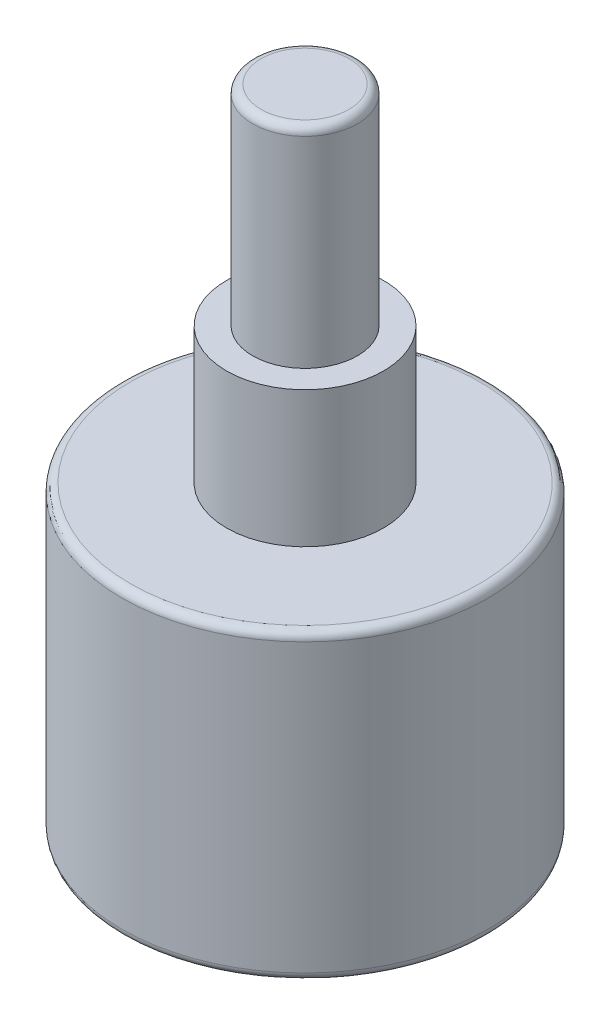
ISO-10303-21;
HEADER;
FILE_DESCRIPTION(('STEP AP214'),'2;1');
FILE_NAME('part.step','',(''),(''),'','','');
FILE_SCHEMA(('AUTOMOTIVE_DESIGN { 1 0 10303 214 1 1 1 1 }'));
ENDSEC;
DATA;
#1=APPLICATION_CONTEXT('core data for automotive mechanical design processes');
#2=APPLICATION_PROTOCOL_DEFINITION('international standard','automotive_design',2000,#1);
#3=PRODUCT_CONTEXT('',#1,'mechanical');
#4=PRODUCT('Part','Part','',(#3));
#5=PRODUCT_RELATED_PRODUCT_CATEGORY('part','',(#4));
#6=PRODUCT_DEFINITION_FORMATION('','',#4);
#7=PRODUCT_DEFINITION_CONTEXT('part definition',#1,'design');
#8=PRODUCT_DEFINITION('design','',#6,#7);
#9=PRODUCT_DEFINITION_SHAPE('','',#8);
#10=(LENGTH_UNIT() NAMED_UNIT(*) SI_UNIT(.MILLI.,.METRE.));
#11=(NAMED_UNIT(*) PLANE_ANGLE_UNIT() SI_UNIT($,.RADIAN.));
#12=(NAMED_UNIT(*) SI_UNIT($,.STERADIAN.) SOLID_ANGLE_UNIT());
#13=UNCERTAINTY_MEASURE_WITH_UNIT(LENGTH_MEASURE(1.E-05),#10,'distance_accuracy_value','');
#14=(GEOMETRIC_REPRESENTATION_CONTEXT(3) GLOBAL_UNCERTAINTY_ASSIGNED_CONTEXT((#13)) GLOBAL_UNIT_ASSIGNED_CONTEXT((#10,
#11,#12)) REPRESENTATION_CONTEXT('',''));
#15=CARTESIAN_POINT('',(0.,0.,0.));
#16=DIRECTION('',(0.,0.,1.));
#17=DIRECTION('',(1.,0.,0.));
#18=AXIS2_PLACEMENT_3D('',#15,#16,#17);
#19=CARTESIAN_POINT('',(0.,26.67,0.));
#20=DIRECTION('',(0.,1.,0.));
#21=DIRECTION('',(0.,0.,1.));
#22=AXIS2_PLACEMENT_3D('',#19,#20,#21);
#23=PLANE('',#22);
#24=CARTESIAN_POINT('',(0.,26.67,0.));
#25=DIRECTION('',(0.,1.,0.));
#26=DIRECTION('',(0.,0.,1.));
#27=AXIS2_PLACEMENT_3D('',#24,#25,#26);
#28=CIRCLE('',#27,4.7625);
#29=CARTESIAN_POINT('',(0.,26.67,4.7625));
#30=VERTEX_POINT('',#29);
#31=EDGE_CURVE('E59',#30,#30,#28,.T.);
#32=ORIENTED_EDGE('',*,*,#31,.T.);
#33=EDGE_LOOP('',(#32));
#34=FACE_BOUND('',#33,.T.);
#35=CARTESIAN_POINT('',(0.,26.67,0.));
#36=DIRECTION('',(0.,1.,0.));
#37=DIRECTION('',(0.,0.,1.));
#38=AXIS2_PLACEMENT_3D('',#35,#36,#37);
#39=CIRCLE('',#38,3.175);
#40=CARTESIAN_POINT('',(0.,26.67,3.175));
#41=VERTEX_POINT('',#40);
#42=EDGE_CURVE('E63',#41,#41,#39,.T.);
#43=ORIENTED_EDGE('',*,*,#42,.F.);
#44=EDGE_LOOP('',(#43));
#45=FACE_BOUND('',#44,.T.);
#46=ADVANCED_FACE('F33',(#34,#45),#23,.T.);
#47=CARTESIAN_POINT('',(0.,18.415,0.));
#48=DIRECTION('',(0.,1.,0.));
#49=DIRECTION('',(0.,0.,1.));
#50=AXIS2_PLACEMENT_3D('',#47,#48,#49);
#51=PLANE('',#50);
#52=CARTESIAN_POINT('',(0.,18.415,0.));
#53=DIRECTION('',(0.,1.,0.));
#54=DIRECTION('',(0.,0.,1.));
#55=AXIS2_PLACEMENT_3D('',#52,#53,#54);
#56=CIRCLE('',#55,10.6045);
#57=CARTESIAN_POINT('',(0.,18.415,10.6045));
#58=VERTEX_POINT('',#57);
#59=EDGE_CURVE('E44',#58,#58,#56,.T.);
#60=ORIENTED_EDGE('',*,*,#59,.T.);
#61=EDGE_LOOP('',(#60));
#62=FACE_BOUND('',#61,.T.);
#63=CARTESIAN_POINT('',(0.,18.415,0.));
#64=DIRECTION('',(0.,1.,0.));
#65=DIRECTION('',(0.,0.,1.));
#66=AXIS2_PLACEMENT_3D('',#63,#64,#65);
#67=CIRCLE('',#66,4.7625);
#68=CARTESIAN_POINT('',(0.,18.415,4.7625));
#69=VERTEX_POINT('',#68);
#70=EDGE_CURVE('E60',#69,#69,#67,.T.);
#71=ORIENTED_EDGE('',*,*,#70,.F.);
#72=EDGE_LOOP('',(#71));
#73=FACE_BOUND('',#72,.T.);
#74=ADVANCED_FACE('F72',(#62,#73),#51,.T.);
#75=CARTESIAN_POINT('',(0.,18.415,0.));
#76=DIRECTION('',(0.,-1.,0.));
#77=DIRECTION('',(0.,0.,-1.));
#78=AXIS2_PLACEMENT_3D('',#75,#76,#77);
#79=CYLINDRICAL_SURFACE('',#78,11.1125);
#80=CARTESIAN_POINT('',(0.,0.508000000000002,0.));
#81=DIRECTION('',(0.,1.,0.));
#82=DIRECTION('',(0.,0.,1.));
#83=AXIS2_PLACEMENT_3D('',#80,#81,#82);
#84=CIRCLE('',#83,11.1125);
#85=CARTESIAN_POINT('',(0.,0.508000000000002,11.1125));
#86=VERTEX_POINT('',#85);
#87=EDGE_CURVE('E53',#86,#86,#84,.T.);
#88=ORIENTED_EDGE('',*,*,#87,.T.);
#89=EDGE_LOOP('',(#88));
#90=FACE_BOUND('',#89,.T.);
#91=CARTESIAN_POINT('',(0.,17.907,0.));
#92=DIRECTION('',(0.,1.,0.));
#93=DIRECTION('',(0.,0.,1.));
#94=AXIS2_PLACEMENT_3D('',#91,#92,#93);
#95=CIRCLE('',#94,11.1125);
#96=CARTESIAN_POINT('',(0.,17.907,11.1125));
#97=VERTEX_POINT('',#96);
#98=EDGE_CURVE('E56',#97,#97,#95,.F.);
#99=ORIENTED_EDGE('',*,*,#98,.T.);
#100=EDGE_LOOP('',(#99));
#101=FACE_BOUND('',#100,.T.);
#102=ADVANCED_FACE('F78',(#90,#101),#79,.T.);
#103=CARTESIAN_POINT('',(0.,0.,0.));
#104=DIRECTION('',(0.,1.,0.));
#105=DIRECTION('',(0.,0.,1.));
#106=AXIS2_PLACEMENT_3D('',#103,#104,#105);
#107=PLANE('',#106);
#108=CARTESIAN_POINT('',(0.,0.,0.));
#109=DIRECTION('',(0.,1.,0.));
#110=DIRECTION('',(0.,0.,1.));
#111=AXIS2_PLACEMENT_3D('',#108,#109,#110);
#112=CIRCLE('',#111,10.6045);
#113=CARTESIAN_POINT('',(0.,0.,10.6045));
#114=VERTEX_POINT('',#113);
#115=EDGE_CURVE('E48',#114,#114,#112,.F.);
#116=ORIENTED_EDGE('',*,*,#115,.T.);
#117=EDGE_LOOP('',(#116));
#118=FACE_BOUND('',#117,.T.);
#119=ADVANCED_FACE('F86',(#118),#107,.F.);
#120=CARTESIAN_POINT('',(0.,26.67,0.));
#121=DIRECTION('',(0.,-1.,0.));
#122=DIRECTION('',(0.,0.,-1.));
#123=AXIS2_PLACEMENT_3D('',#120,#121,#122);
#124=CYLINDRICAL_SURFACE('',#123,4.7625);
#125=ORIENTED_EDGE('',*,*,#31,.F.);
#126=EDGE_LOOP('',(#125));
#127=FACE_BOUND('',#126,.T.);
#128=ORIENTED_EDGE('',*,*,#70,.T.);
#129=EDGE_LOOP('',(#128));
#130=FACE_BOUND('',#129,.T.);
#131=ADVANCED_FACE('F84',(#127,#130),#124,.T.);
#132=CARTESIAN_POINT('',(0.,39.37,0.));
#133=DIRECTION('',(0.,-1.,0.));
#134=DIRECTION('',(0.,0.,-1.));
#135=AXIS2_PLACEMENT_3D('',#132,#133,#134);
#136=CYLINDRICAL_SURFACE('',#135,3.175);
#137=CARTESIAN_POINT('',(0.,38.862,0.));
#138=DIRECTION('',(0.,1.,0.));
#139=DIRECTION('',(0.,0.,1.));
#140=AXIS2_PLACEMENT_3D('',#137,#138,#139);
#141=CIRCLE('',#140,3.175);
#142=CARTESIAN_POINT('',(0.,38.862,3.175));
#143=VERTEX_POINT('',#142);
#144=EDGE_CURVE('E10',#143,#143,#141,.F.);
#145=ORIENTED_EDGE('',*,*,#144,.T.);
#146=EDGE_LOOP('',(#145));
#147=FACE_BOUND('',#146,.T.);
#148=ORIENTED_EDGE('',*,*,#42,.T.);
#149=EDGE_LOOP('',(#148));
#150=FACE_BOUND('',#149,.T.);
#151=ADVANCED_FACE('F69',(#147,#150),#136,.T.);
#152=CARTESIAN_POINT('',(0.,39.37,0.));
#153=DIRECTION('',(0.,1.,0.));
#154=DIRECTION('',(0.,0.,1.));
#155=AXIS2_PLACEMENT_3D('',#152,#153,#154);
#156=PLANE('',#155);
#157=CARTESIAN_POINT('',(0.,39.37,0.));
#158=DIRECTION('',(0.,1.,0.));
#159=DIRECTION('',(0.,0.,1.));
#160=AXIS2_PLACEMENT_3D('',#157,#158,#159);
#161=CIRCLE('',#160,2.667);
#162=CARTESIAN_POINT('',(0.,39.37,2.667));
#163=VERTEX_POINT('',#162);
#164=EDGE_CURVE('E40',#163,#163,#161,.T.);
#165=ORIENTED_EDGE('',*,*,#164,.T.);
#166=EDGE_LOOP('',(#165));
#167=FACE_BOUND('',#166,.T.);
#168=ADVANCED_FACE('F98',(#167),#156,.T.);
#169=CARTESIAN_POINT('',(0.,0.508000000000002,0.));
#170=DIRECTION('',(0.,1.,0.));
#171=DIRECTION('',(0.,0.,1.));
#172=AXIS2_PLACEMENT_3D('',#169,#170,#171);
#173=TOROIDAL_SURFACE('',#172,10.6045,0.508);
#174=ORIENTED_EDGE('',*,*,#115,.F.);
#175=EDGE_LOOP('',(#174));
#176=FACE_BOUND('',#175,.T.);
#177=ORIENTED_EDGE('',*,*,#87,.F.);
#178=EDGE_LOOP('',(#177));
#179=FACE_BOUND('',#178,.T.);
#180=ADVANCED_FACE('F95',(#176,#179),#173,.T.);
#181=CARTESIAN_POINT('',(0.,17.907,0.));
#182=DIRECTION('',(0.,1.,0.));
#183=DIRECTION('',(0.,0.,1.));
#184=AXIS2_PLACEMENT_3D('',#181,#182,#183);
#185=TOROIDAL_SURFACE('',#184,10.6045,0.508);
#186=ORIENTED_EDGE('',*,*,#98,.F.);
#187=EDGE_LOOP('',(#186));
#188=FACE_BOUND('',#187,.T.);
#189=ORIENTED_EDGE('',*,*,#59,.F.);
#190=EDGE_LOOP('',(#189));
#191=FACE_BOUND('',#190,.T.);
#192=ADVANCED_FACE('F97',(#188,#191),#185,.T.);
#193=CARTESIAN_POINT('',(0.,38.862,0.));
#194=DIRECTION('',(0.,1.,0.));
#195=DIRECTION('',(0.,0.,1.));
#196=AXIS2_PLACEMENT_3D('',#193,#194,#195);
#197=TOROIDAL_SURFACE('',#196,2.667,0.508);
#198=ORIENTED_EDGE('',*,*,#144,.F.);
#199=EDGE_LOOP('',(#198));
#200=FACE_BOUND('',#199,.T.);
#201=ORIENTED_EDGE('',*,*,#164,.F.);
#202=EDGE_LOOP('',(#201));
#203=FACE_BOUND('',#202,.T.);
#204=ADVANCED_FACE('F35',(#200,#203),#197,.T.);
#205=CLOSED_SHELL('',(#46,#74,#102,#119,#131,#151,#168,#180,#192,#204));
#206=MANIFOLD_SOLID_BREP('B2',#205);
#207=ADVANCED_BREP_SHAPE_REPRESENTATION('',(#18,#206),#14);
#208=SHAPE_DEFINITION_REPRESENTATION(#9,#207);
ENDSEC;
END-ISO-10303-21;
